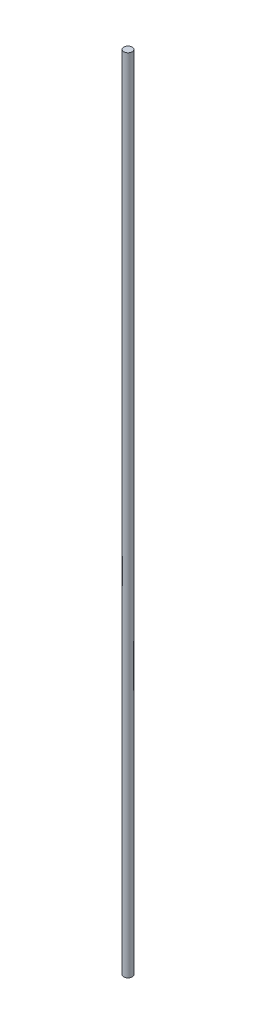
ISO-10303-21;
HEADER;
FILE_DESCRIPTION(('STEP AP214'),'2;1');
FILE_NAME('part.step','',(''),(''),'','','');
FILE_SCHEMA(('AUTOMOTIVE_DESIGN { 1 0 10303 214 1 1 1 1 }'));
ENDSEC;
DATA;
#1=APPLICATION_CONTEXT('core data for automotive mechanical design processes');
#2=APPLICATION_PROTOCOL_DEFINITION('international standard','automotive_design',2000,#1);
#3=PRODUCT_CONTEXT('',#1,'mechanical');
#4=PRODUCT('Part','Part','',(#3));
#5=PRODUCT_RELATED_PRODUCT_CATEGORY('part','',(#4));
#6=PRODUCT_DEFINITION_FORMATION('','',#4);
#7=PRODUCT_DEFINITION_CONTEXT('part definition',#1,'design');
#8=PRODUCT_DEFINITION('design','',#6,#7);
#9=PRODUCT_DEFINITION_SHAPE('','',#8);
#10=(LENGTH_UNIT() NAMED_UNIT(*) SI_UNIT(.MILLI.,.METRE.));
#11=(NAMED_UNIT(*) PLANE_ANGLE_UNIT() SI_UNIT($,.RADIAN.));
#12=(NAMED_UNIT(*) SI_UNIT($,.STERADIAN.) SOLID_ANGLE_UNIT());
#13=UNCERTAINTY_MEASURE_WITH_UNIT(LENGTH_MEASURE(1.E-05),#10,'distance_accuracy_value','');
#14=(GEOMETRIC_REPRESENTATION_CONTEXT(3) GLOBAL_UNCERTAINTY_ASSIGNED_CONTEXT((#13)) GLOBAL_UNIT_ASSIGNED_CONTEXT((#10,
#11,#12)) REPRESENTATION_CONTEXT('',''));
#15=CARTESIAN_POINT('',(0.,0.,0.));
#16=DIRECTION('',(0.,0.,1.));
#17=DIRECTION('',(1.,0.,0.));
#18=AXIS2_PLACEMENT_3D('',#15,#16,#17);
#19=CARTESIAN_POINT('',(0.,457.2,0.));
#20=DIRECTION('',(0.,-1.,0.));
#21=DIRECTION('',(0.,0.,-1.));
#22=AXIS2_PLACEMENT_3D('',#19,#20,#21);
#23=CYLINDRICAL_SURFACE('',#22,4.7625);
#24=CARTESIAN_POINT('',(0.,457.2,0.));
#25=DIRECTION('',(0.,1.,0.));
#26=DIRECTION('',(0.,0.,1.));
#27=AXIS2_PLACEMENT_3D('',#24,#25,#26);
#28=CIRCLE('',#27,4.7625);
#29=CARTESIAN_POINT('',(0.,457.2,4.7625));
#30=VERTEX_POINT('',#29);
#31=EDGE_CURVE('E10',#30,#30,#28,.T.);
#32=ORIENTED_EDGE('',*,*,#31,.F.);
#33=EDGE_LOOP('',(#32));
#34=FACE_BOUND('',#33,.T.);
#35=CARTESIAN_POINT('',(0.,-457.2,0.));
#36=DIRECTION('',(0.,1.,0.));
#37=DIRECTION('',(0.,0.,1.));
#38=AXIS2_PLACEMENT_3D('',#35,#36,#37);
#39=CIRCLE('',#38,4.7625);
#40=CARTESIAN_POINT('',(0.,-457.2,4.7625));
#41=VERTEX_POINT('',#40);
#42=EDGE_CURVE('E35',#41,#41,#39,.T.);
#43=ORIENTED_EDGE('',*,*,#42,.T.);
#44=EDGE_LOOP('',(#43));
#45=FACE_BOUND('',#44,.T.);
#46=ADVANCED_FACE('F32',(#34,#45),#23,.T.);
#47=CARTESIAN_POINT('',(0.,457.2,0.));
#48=DIRECTION('',(0.,1.,0.));
#49=DIRECTION('',(0.,0.,1.));
#50=AXIS2_PLACEMENT_3D('',#47,#48,#49);
#51=PLANE('',#50);
#52=ORIENTED_EDGE('',*,*,#31,.T.);
#53=EDGE_LOOP('',(#52));
#54=FACE_BOUND('',#53,.T.);
#55=ADVANCED_FACE('F47',(#54),#51,.T.);
#56=CARTESIAN_POINT('',(0.,-457.2,0.));
#57=DIRECTION('',(0.,1.,0.));
#58=DIRECTION('',(0.,0.,1.));
#59=AXIS2_PLACEMENT_3D('',#56,#57,#58);
#60=PLANE('',#59);
#61=ORIENTED_EDGE('',*,*,#42,.F.);
#62=EDGE_LOOP('',(#61));
#63=FACE_BOUND('',#62,.T.);
#64=ADVANCED_FACE('F45',(#63),#60,.F.);
#65=CLOSED_SHELL('',(#46,#55,#64));
#66=MANIFOLD_SOLID_BREP('B2',#65);
#67=ADVANCED_BREP_SHAPE_REPRESENTATION('',(#18,#66),#14);
#68=SHAPE_DEFINITION_REPRESENTATION(#9,#67);
ENDSEC;
END-ISO-10303-21;
